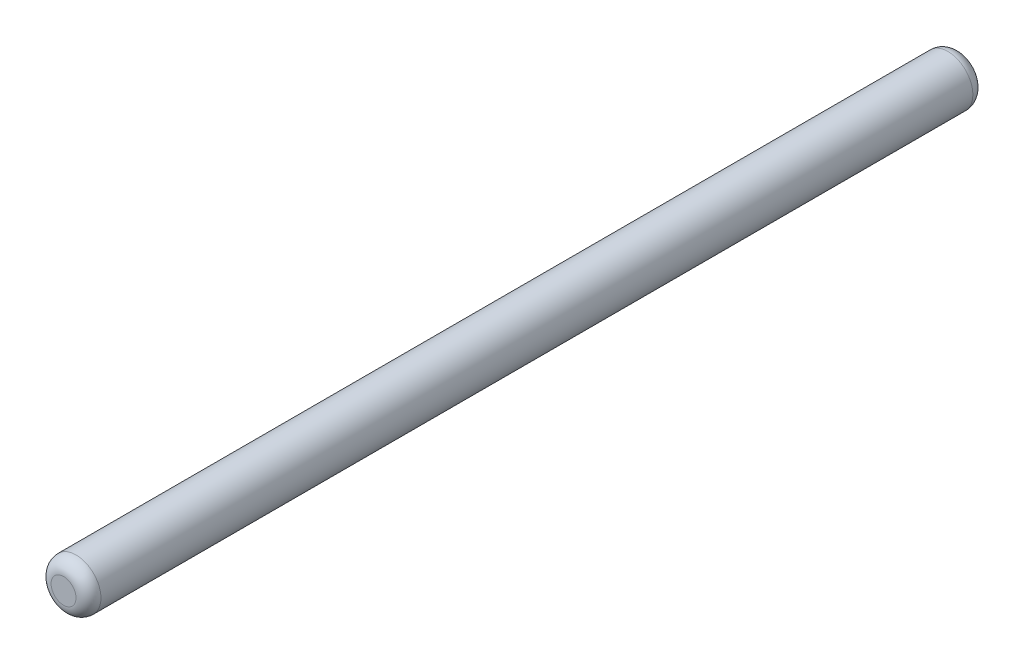
ISO-10303-21;
HEADER;
FILE_DESCRIPTION(('STEP AP214'),'2;1');
FILE_NAME('part.step','',(''),(''),'','','');
FILE_SCHEMA(('AUTOMOTIVE_DESIGN { 1 0 10303 214 1 1 1 1 }'));
ENDSEC;
DATA;
#1=APPLICATION_CONTEXT('core data for automotive mechanical design processes');
#2=APPLICATION_PROTOCOL_DEFINITION('international standard','automotive_design',2000,#1);
#3=PRODUCT_CONTEXT('',#1,'mechanical');
#4=PRODUCT('Part','Part','',(#3));
#5=PRODUCT_RELATED_PRODUCT_CATEGORY('part','',(#4));
#6=PRODUCT_DEFINITION_FORMATION('','',#4);
#7=PRODUCT_DEFINITION_CONTEXT('part definition',#1,'design');
#8=PRODUCT_DEFINITION('design','',#6,#7);
#9=PRODUCT_DEFINITION_SHAPE('','',#8);
#10=(LENGTH_UNIT() NAMED_UNIT(*) SI_UNIT(.MILLI.,.METRE.));
#11=(NAMED_UNIT(*) PLANE_ANGLE_UNIT() SI_UNIT($,.RADIAN.));
#12=(NAMED_UNIT(*) SI_UNIT($,.STERADIAN.) SOLID_ANGLE_UNIT());
#13=UNCERTAINTY_MEASURE_WITH_UNIT(LENGTH_MEASURE(1.E-05),#10,'distance_accuracy_value','');
#14=(GEOMETRIC_REPRESENTATION_CONTEXT(3) GLOBAL_UNCERTAINTY_ASSIGNED_CONTEXT((#13)) GLOBAL_UNIT_ASSIGNED_CONTEXT((#10,
#11,#12)) REPRESENTATION_CONTEXT('',''));
#15=CARTESIAN_POINT('',(0.,0.,0.));
#16=DIRECTION('',(0.,0.,1.));
#17=DIRECTION('',(1.,0.,0.));
#18=AXIS2_PLACEMENT_3D('',#15,#16,#17);
#19=CARTESIAN_POINT('',(0.,0.,144.));
#20=DIRECTION('',(0.,0.,-1.));
#21=DIRECTION('',(-1.,0.,0.));
#22=AXIS2_PLACEMENT_3D('',#19,#20,#21);
#23=CYLINDRICAL_SURFACE('',#22,4.);
#24=CARTESIAN_POINT('',(0.,0.,142.));
#25=DIRECTION('',(0.,0.,1.));
#26=DIRECTION('',(1.,0.,0.));
#27=AXIS2_PLACEMENT_3D('',#24,#25,#26);
#28=CIRCLE('',#27,4.);
#29=CARTESIAN_POINT('',(4.,0.,142.));
#30=VERTEX_POINT('',#29);
#31=EDGE_CURVE('E49',#30,#30,#28,.F.);
#32=ORIENTED_EDGE('',*,*,#31,.T.);
#33=EDGE_LOOP('',(#32));
#34=FACE_BOUND('',#33,.T.);
#35=CARTESIAN_POINT('',(0.,0.,2.));
#36=DIRECTION('',(0.,0.,1.));
#37=DIRECTION('',(1.,0.,0.));
#38=AXIS2_PLACEMENT_3D('',#35,#36,#37);
#39=CIRCLE('',#38,4.);
#40=CARTESIAN_POINT('',(4.,0.,2.));
#41=VERTEX_POINT('',#40);
#42=EDGE_CURVE('E54',#41,#41,#39,.T.);
#43=ORIENTED_EDGE('',*,*,#42,.T.);
#44=EDGE_LOOP('',(#43));
#45=FACE_BOUND('',#44,.T.);
#46=ADVANCED_FACE('F41',(#34,#45),#23,.T.);
#47=CARTESIAN_POINT('',(0.,0.,144.));
#48=DIRECTION('',(0.,0.,1.));
#49=DIRECTION('',(1.,0.,0.));
#50=AXIS2_PLACEMENT_3D('',#47,#48,#49);
#51=PLANE('',#50);
#52=CARTESIAN_POINT('',(0.,0.,144.));
#53=DIRECTION('',(0.,0.,1.));
#54=DIRECTION('',(1.,0.,0.));
#55=AXIS2_PLACEMENT_3D('',#52,#53,#54);
#56=CIRCLE('',#55,2.);
#57=CARTESIAN_POINT('',(2.,0.,144.));
#58=VERTEX_POINT('',#57);
#59=EDGE_CURVE('E59',#58,#58,#56,.T.);
#60=ORIENTED_EDGE('',*,*,#59,.T.);
#61=EDGE_LOOP('',(#60));
#62=FACE_BOUND('',#61,.T.);
#63=ADVANCED_FACE('F66',(#62),#51,.T.);
#64=CARTESIAN_POINT('',(0.,0.,0.));
#65=DIRECTION('',(0.,0.,1.));
#66=DIRECTION('',(1.,0.,0.));
#67=AXIS2_PLACEMENT_3D('',#64,#65,#66);
#68=PLANE('',#67);
#69=CARTESIAN_POINT('',(0.,0.,0.));
#70=DIRECTION('',(0.,0.,1.));
#71=DIRECTION('',(1.,0.,0.));
#72=AXIS2_PLACEMENT_3D('',#69,#70,#71);
#73=CIRCLE('',#72,2.);
#74=CARTESIAN_POINT('',(2.,0.,0.));
#75=VERTEX_POINT('',#74);
#76=EDGE_CURVE('E10',#75,#75,#73,.F.);
#77=ORIENTED_EDGE('',*,*,#76,.T.);
#78=EDGE_LOOP('',(#77));
#79=FACE_BOUND('',#78,.T.);
#80=ADVANCED_FACE('F70',(#79),#68,.F.);
#81=CARTESIAN_POINT('',(0.,0.,142.));
#82=DIRECTION('',(0.,0.,1.));
#83=DIRECTION('',(1.,0.,0.));
#84=AXIS2_PLACEMENT_3D('',#81,#82,#83);
#85=DEGENERATE_TOROIDAL_SURFACE('',#84,2.,2.,.T.);
#86=ORIENTED_EDGE('',*,*,#31,.F.);
#87=EDGE_LOOP('',(#86));
#88=FACE_BOUND('',#87,.T.);
#89=ORIENTED_EDGE('',*,*,#59,.F.);
#90=EDGE_LOOP('',(#89));
#91=FACE_BOUND('',#90,.T.);
#92=ADVANCED_FACE('F68',(#88,#91),#85,.T.);
#93=CARTESIAN_POINT('',(0.,0.,2.));
#94=DIRECTION('',(0.,0.,1.));
#95=DIRECTION('',(1.,0.,0.));
#96=AXIS2_PLACEMENT_3D('',#93,#94,#95);
#97=DEGENERATE_TOROIDAL_SURFACE('',#96,2.,2.,.T.);
#98=ORIENTED_EDGE('',*,*,#76,.F.);
#99=EDGE_LOOP('',(#98));
#100=FACE_BOUND('',#99,.T.);
#101=ORIENTED_EDGE('',*,*,#42,.F.);
#102=EDGE_LOOP('',(#101));
#103=FACE_BOUND('',#102,.T.);
#104=ADVANCED_FACE('F43',(#100,#103),#97,.T.);
#105=CLOSED_SHELL('',(#46,#63,#80,#92,#104));
#106=MANIFOLD_SOLID_BREP('B2',#105);
#107=ADVANCED_BREP_SHAPE_REPRESENTATION('',(#18,#106),#14);
#108=SHAPE_DEFINITION_REPRESENTATION(#9,#107);
ENDSEC;
END-ISO-10303-21;
